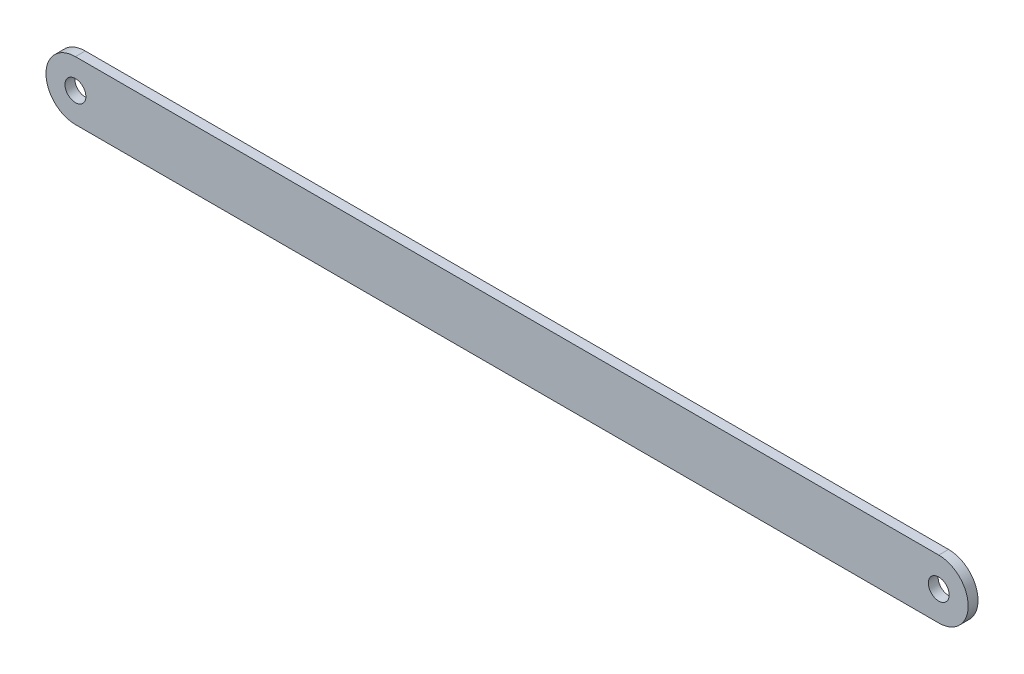
ISO-10303-21;
HEADER;
FILE_DESCRIPTION(('STEP AP214'),'2;1');
FILE_NAME('part.step','',(''),(''),'','','');
FILE_SCHEMA(('AUTOMOTIVE_DESIGN { 1 0 10303 214 1 1 1 1 }'));
ENDSEC;
DATA;
#1=APPLICATION_CONTEXT('core data for automotive mechanical design processes');
#2=APPLICATION_PROTOCOL_DEFINITION('international standard','automotive_design',2000,#1);
#3=PRODUCT_CONTEXT('',#1,'mechanical');
#4=PRODUCT('Part','Part','',(#3));
#5=PRODUCT_RELATED_PRODUCT_CATEGORY('part','',(#4));
#6=PRODUCT_DEFINITION_FORMATION('','',#4);
#7=PRODUCT_DEFINITION_CONTEXT('part definition',#1,'design');
#8=PRODUCT_DEFINITION('design','',#6,#7);
#9=PRODUCT_DEFINITION_SHAPE('','',#8);
#10=(LENGTH_UNIT() NAMED_UNIT(*) SI_UNIT(.MILLI.,.METRE.));
#11=(NAMED_UNIT(*) PLANE_ANGLE_UNIT() SI_UNIT($,.RADIAN.));
#12=(NAMED_UNIT(*) SI_UNIT($,.STERADIAN.) SOLID_ANGLE_UNIT());
#13=UNCERTAINTY_MEASURE_WITH_UNIT(LENGTH_MEASURE(1.E-05),#10,'distance_accuracy_value','');
#14=(GEOMETRIC_REPRESENTATION_CONTEXT(3) GLOBAL_UNCERTAINTY_ASSIGNED_CONTEXT((#13)) GLOBAL_UNIT_ASSIGNED_CONTEXT((#10,
#11,#12)) REPRESENTATION_CONTEXT('',''));
#15=CARTESIAN_POINT('',(0.,0.,0.));
#16=DIRECTION('',(0.,0.,1.));
#17=DIRECTION('',(1.,0.,0.));
#18=AXIS2_PLACEMENT_3D('',#15,#16,#17);
#19=CARTESIAN_POINT('',(139.7,0.,1.5875));
#20=DIRECTION('',(0.,0.,-1.));
#21=DIRECTION('',(-1.,0.,0.));
#22=AXIS2_PLACEMENT_3D('',#19,#20,#21);
#23=CYLINDRICAL_SURFACE('',#22,9.525);
#24=CARTESIAN_POINT('',(139.7,0.,-1.5875));
#25=DIRECTION('',(0.,0.,1.));
#26=DIRECTION('',(1.,0.,0.));
#27=AXIS2_PLACEMENT_3D('',#24,#25,#26);
#28=CIRCLE('',#27,9.525);
#29=CARTESIAN_POINT('',(139.7,-9.525,-1.5875));
#30=VERTEX_POINT('',#29);
#31=CARTESIAN_POINT('',(139.7,9.525,-1.5875));
#32=VERTEX_POINT('',#31);
#33=EDGE_CURVE('E98',#30,#32,#28,.T.);
#34=ORIENTED_EDGE('',*,*,#33,.T.);
#35=DIRECTION('',(0.,0.,-1.));
#36=VECTOR('',#35,1.);
#37=CARTESIAN_POINT('',(139.7,9.525,1.5875));
#38=LINE('',#37,#36);
#39=CARTESIAN_POINT('',(139.7,9.525,1.5875));
#40=VERTEX_POINT('',#39);
#41=EDGE_CURVE('E11',#40,#32,#38,.T.);
#42=ORIENTED_EDGE('',*,*,#41,.F.);
#43=CARTESIAN_POINT('',(139.7,0.,1.5875));
#44=DIRECTION('',(0.,0.,1.));
#45=DIRECTION('',(1.,0.,0.));
#46=AXIS2_PLACEMENT_3D('',#43,#44,#45);
#47=CIRCLE('',#46,9.525);
#48=CARTESIAN_POINT('',(139.7,-9.525,1.5875));
#49=VERTEX_POINT('',#48);
#50=EDGE_CURVE('E86',#49,#40,#47,.T.);
#51=ORIENTED_EDGE('',*,*,#50,.F.);
#52=DIRECTION('',(0.,0.,-1.));
#53=VECTOR('',#52,1.);
#54=CARTESIAN_POINT('',(139.7,-9.525,1.5875));
#55=LINE('',#54,#53);
#56=EDGE_CURVE('E94',#49,#30,#55,.T.);
#57=ORIENTED_EDGE('',*,*,#56,.T.);
#58=EDGE_LOOP('',(#34,#42,#51,#57));
#59=FACE_BOUND('',#58,.T.);
#60=ADVANCED_FACE('F35',(#59),#23,.T.);
#61=CARTESIAN_POINT('',(139.7,9.525,1.5875));
#62=DIRECTION('',(0.,-1.,0.));
#63=DIRECTION('',(1.,0.,0.));
#64=AXIS2_PLACEMENT_3D('',#61,#62,#63);
#65=PLANE('',#64);
#66=DIRECTION('',(-1.,0.,0.));
#67=VECTOR('',#66,1.);
#68=CARTESIAN_POINT('',(139.7,9.525,-1.5875));
#69=LINE('',#68,#67);
#70=CARTESIAN_POINT('',(-139.7,9.52499999999998,-1.5875));
#71=VERTEX_POINT('',#70);
#72=EDGE_CURVE('E90',#32,#71,#69,.T.);
#73=ORIENTED_EDGE('',*,*,#72,.T.);
#74=DIRECTION('',(0.,0.,-1.));
#75=VECTOR('',#74,1.);
#76=CARTESIAN_POINT('',(-139.7,9.52499999999998,1.5875));
#77=LINE('',#76,#75);
#78=CARTESIAN_POINT('',(-139.7,9.52499999999998,1.5875));
#79=VERTEX_POINT('',#78);
#80=EDGE_CURVE('E43',#79,#71,#77,.T.);
#81=ORIENTED_EDGE('',*,*,#80,.F.);
#82=DIRECTION('',(-1.,0.,0.));
#83=VECTOR('',#82,1.);
#84=CARTESIAN_POINT('',(139.7,9.525,1.5875));
#85=LINE('',#84,#83);
#86=EDGE_CURVE('E81',#40,#79,#85,.T.);
#87=ORIENTED_EDGE('',*,*,#86,.F.);
#88=ORIENTED_EDGE('',*,*,#41,.T.);
#89=EDGE_LOOP('',(#73,#81,#87,#88));
#90=FACE_BOUND('',#89,.T.);
#91=ADVANCED_FACE('F89',(#90),#65,.F.);
#92=CARTESIAN_POINT('',(-139.7,0.,1.5875));
#93=DIRECTION('',(0.,0.,-1.));
#94=DIRECTION('',(-1.,0.,0.));
#95=AXIS2_PLACEMENT_3D('',#92,#93,#94);
#96=CYLINDRICAL_SURFACE('',#95,9.525);
#97=CARTESIAN_POINT('',(-139.7,0.,-1.5875));
#98=DIRECTION('',(0.,0.,1.));
#99=DIRECTION('',(1.,0.,0.));
#100=AXIS2_PLACEMENT_3D('',#97,#98,#99);
#101=CIRCLE('',#100,9.525);
#102=CARTESIAN_POINT('',(-139.7,-9.52500000000003,-1.5875));
#103=VERTEX_POINT('',#102);
#104=EDGE_CURVE('E68',#71,#103,#101,.T.);
#105=ORIENTED_EDGE('',*,*,#104,.T.);
#106=DIRECTION('',(0.,0.,-1.));
#107=VECTOR('',#106,1.);
#108=CARTESIAN_POINT('',(-139.7,-9.52500000000003,1.5875));
#109=LINE('',#108,#107);
#110=CARTESIAN_POINT('',(-139.7,-9.52500000000003,1.5875));
#111=VERTEX_POINT('',#110);
#112=EDGE_CURVE('E91',#111,#103,#109,.T.);
#113=ORIENTED_EDGE('',*,*,#112,.F.);
#114=CARTESIAN_POINT('',(-139.7,0.,1.5875));
#115=DIRECTION('',(0.,0.,1.));
#116=DIRECTION('',(1.,0.,0.));
#117=AXIS2_PLACEMENT_3D('',#114,#115,#116);
#118=CIRCLE('',#117,9.525);
#119=EDGE_CURVE('E84',#79,#111,#118,.T.);
#120=ORIENTED_EDGE('',*,*,#119,.F.);
#121=ORIENTED_EDGE('',*,*,#80,.T.);
#122=EDGE_LOOP('',(#105,#113,#120,#121));
#123=FACE_BOUND('',#122,.T.);
#124=ADVANCED_FACE('F92',(#123),#96,.T.);
#125=CARTESIAN_POINT('',(139.7,-9.525,1.5875));
#126=DIRECTION('',(0.,1.,0.));
#127=DIRECTION('',(-1.,0.,0.));
#128=AXIS2_PLACEMENT_3D('',#125,#126,#127);
#129=PLANE('',#128);
#130=DIRECTION('',(1.,0.,0.));
#131=VECTOR('',#130,1.);
#132=CARTESIAN_POINT('',(139.7,-9.525,-1.5875));
#133=LINE('',#132,#131);
#134=EDGE_CURVE('E74',#103,#30,#133,.T.);
#135=ORIENTED_EDGE('',*,*,#134,.T.);
#136=ORIENTED_EDGE('',*,*,#56,.F.);
#137=DIRECTION('',(1.,0.,0.));
#138=VECTOR('',#137,1.);
#139=CARTESIAN_POINT('',(139.7,-9.525,1.5875));
#140=LINE('',#139,#138);
#141=EDGE_CURVE('E51',#111,#49,#140,.T.);
#142=ORIENTED_EDGE('',*,*,#141,.F.);
#143=ORIENTED_EDGE('',*,*,#112,.T.);
#144=EDGE_LOOP('',(#135,#136,#142,#143));
#145=FACE_BOUND('',#144,.T.);
#146=ADVANCED_FACE('F106',(#145),#129,.F.);
#147=CARTESIAN_POINT('',(139.7,0.,1.5875));
#148=DIRECTION('',(0.,0.,1.));
#149=DIRECTION('',(1.,0.,0.));
#150=AXIS2_PLACEMENT_3D('',#147,#148,#149);
#151=PLANE('',#150);
#152=CARTESIAN_POINT('',(-139.7,0.,1.5875));
#153=DIRECTION('',(0.,0.,1.));
#154=DIRECTION('',(1.,0.,0.));
#155=AXIS2_PLACEMENT_3D('',#152,#153,#154);
#156=CIRCLE('',#155,3.3782);
#157=CARTESIAN_POINT('',(-136.3218,0.,1.5875));
#158=VERTEX_POINT('',#157);
#159=EDGE_CURVE('E120',#158,#158,#156,.T.);
#160=ORIENTED_EDGE('',*,*,#159,.F.);
#161=EDGE_LOOP('',(#160));
#162=FACE_BOUND('',#161,.T.);
#163=CARTESIAN_POINT('',(139.7,0.,1.5875));
#164=DIRECTION('',(0.,0.,1.));
#165=DIRECTION('',(1.,0.,0.));
#166=AXIS2_PLACEMENT_3D('',#163,#164,#165);
#167=CIRCLE('',#166,3.3782);
#168=CARTESIAN_POINT('',(143.0782,0.,1.5875));
#169=VERTEX_POINT('',#168);
#170=EDGE_CURVE('E114',#169,#169,#167,.T.);
#171=ORIENTED_EDGE('',*,*,#170,.F.);
#172=EDGE_LOOP('',(#171));
#173=FACE_BOUND('',#172,.T.);
#174=ORIENTED_EDGE('',*,*,#50,.T.);
#175=ORIENTED_EDGE('',*,*,#86,.T.);
#176=ORIENTED_EDGE('',*,*,#119,.T.);
#177=ORIENTED_EDGE('',*,*,#141,.T.);
#178=EDGE_LOOP('',(#174,#175,#176,#177));
#179=FACE_BOUND('',#178,.T.);
#180=ADVANCED_FACE('F82',(#162,#173,#179),#151,.T.);
#181=CARTESIAN_POINT('',(139.7,0.,-1.5875));
#182=DIRECTION('',(0.,0.,1.));
#183=DIRECTION('',(1.,0.,0.));
#184=AXIS2_PLACEMENT_3D('',#181,#182,#183);
#185=PLANE('',#184);
#186=CARTESIAN_POINT('',(-139.7,0.,-1.5875));
#187=DIRECTION('',(0.,0.,1.));
#188=DIRECTION('',(1.,0.,0.));
#189=AXIS2_PLACEMENT_3D('',#186,#187,#188);
#190=CIRCLE('',#189,3.3782);
#191=CARTESIAN_POINT('',(-136.3218,0.,-1.5875));
#192=VERTEX_POINT('',#191);
#193=EDGE_CURVE('E117',#192,#192,#190,.T.);
#194=ORIENTED_EDGE('',*,*,#193,.T.);
#195=EDGE_LOOP('',(#194));
#196=FACE_BOUND('',#195,.T.);
#197=CARTESIAN_POINT('',(139.7,0.,-1.5875));
#198=DIRECTION('',(0.,0.,1.));
#199=DIRECTION('',(1.,0.,0.));
#200=AXIS2_PLACEMENT_3D('',#197,#198,#199);
#201=CIRCLE('',#200,3.3782);
#202=CARTESIAN_POINT('',(143.0782,0.,-1.5875));
#203=VERTEX_POINT('',#202);
#204=EDGE_CURVE('E101',#203,#203,#201,.T.);
#205=ORIENTED_EDGE('',*,*,#204,.T.);
#206=EDGE_LOOP('',(#205));
#207=FACE_BOUND('',#206,.T.);
#208=ORIENTED_EDGE('',*,*,#33,.F.);
#209=ORIENTED_EDGE('',*,*,#134,.F.);
#210=ORIENTED_EDGE('',*,*,#104,.F.);
#211=ORIENTED_EDGE('',*,*,#72,.F.);
#212=EDGE_LOOP('',(#208,#209,#210,#211));
#213=FACE_BOUND('',#212,.T.);
#214=ADVANCED_FACE('F109',(#196,#207,#213),#185,.F.);
#215=CARTESIAN_POINT('',(139.7,0.,1.5875));
#216=DIRECTION('',(0.,0.,1.));
#217=DIRECTION('',(1.,0.,0.));
#218=AXIS2_PLACEMENT_3D('',#215,#216,#217);
#219=CYLINDRICAL_SURFACE('',#218,3.3782);
#220=ORIENTED_EDGE('',*,*,#204,.F.);
#221=EDGE_LOOP('',(#220));
#222=FACE_BOUND('',#221,.T.);
#223=ORIENTED_EDGE('',*,*,#170,.T.);
#224=EDGE_LOOP('',(#223));
#225=FACE_BOUND('',#224,.T.);
#226=ADVANCED_FACE('F131',(#222,#225),#219,.F.);
#227=CARTESIAN_POINT('',(-139.7,0.,1.5875));
#228=DIRECTION('',(0.,0.,1.));
#229=DIRECTION('',(1.,0.,0.));
#230=AXIS2_PLACEMENT_3D('',#227,#228,#229);
#231=CYLINDRICAL_SURFACE('',#230,3.3782);
#232=ORIENTED_EDGE('',*,*,#193,.F.);
#233=EDGE_LOOP('',(#232));
#234=FACE_BOUND('',#233,.T.);
#235=ORIENTED_EDGE('',*,*,#159,.T.);
#236=EDGE_LOOP('',(#235));
#237=FACE_BOUND('',#236,.T.);
#238=ADVANCED_FACE('F124',(#234,#237),#231,.F.);
#239=CLOSED_SHELL('',(#60,#91,#124,#146,#180,#214,#226,#238));
#240=MANIFOLD_SOLID_BREP('B2',#239);
#241=ADVANCED_BREP_SHAPE_REPRESENTATION('',(#18,#240),#14);
#242=SHAPE_DEFINITION_REPRESENTATION(#9,#241);
ENDSEC;
END-ISO-10303-21;
